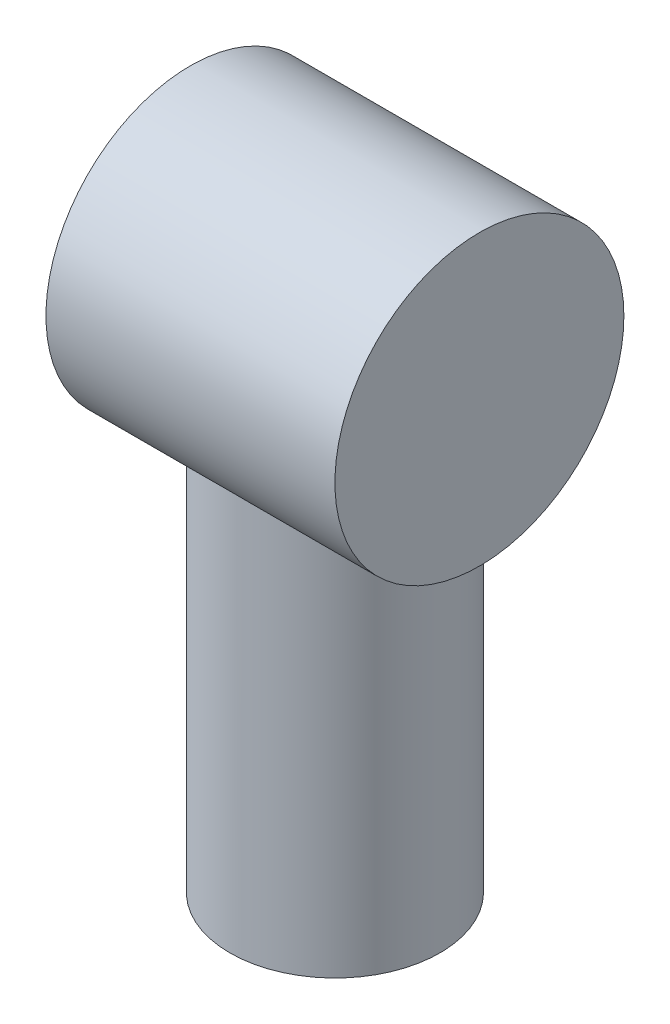
ISO-10303-21;
HEADER;
FILE_DESCRIPTION(('STEP AP214'),'2;1');
FILE_NAME('part.step','',(''),(''),'','','');
FILE_SCHEMA(('AUTOMOTIVE_DESIGN { 1 0 10303 214 1 1 1 1 }'));
ENDSEC;
DATA;
#1=APPLICATION_CONTEXT('core data for automotive mechanical design processes');
#2=APPLICATION_PROTOCOL_DEFINITION('international standard','automotive_design',2000,#1);
#3=PRODUCT_CONTEXT('',#1,'mechanical');
#4=PRODUCT('Part','Part','',(#3));
#5=PRODUCT_RELATED_PRODUCT_CATEGORY('part','',(#4));
#6=PRODUCT_DEFINITION_FORMATION('','',#4);
#7=PRODUCT_DEFINITION_CONTEXT('part definition',#1,'design');
#8=PRODUCT_DEFINITION('design','',#6,#7);
#9=PRODUCT_DEFINITION_SHAPE('','',#8);
#10=(LENGTH_UNIT() NAMED_UNIT(*) SI_UNIT(.MILLI.,.METRE.));
#11=(NAMED_UNIT(*) PLANE_ANGLE_UNIT() SI_UNIT($,.RADIAN.));
#12=(NAMED_UNIT(*) SI_UNIT($,.STERADIAN.) SOLID_ANGLE_UNIT());
#13=UNCERTAINTY_MEASURE_WITH_UNIT(LENGTH_MEASURE(1.E-05),#10,'distance_accuracy_value','');
#14=(GEOMETRIC_REPRESENTATION_CONTEXT(3) GLOBAL_UNCERTAINTY_ASSIGNED_CONTEXT((#13)) GLOBAL_UNIT_ASSIGNED_CONTEXT((#10,
#11,#12)) REPRESENTATION_CONTEXT('',''));
#15=CARTESIAN_POINT('',(0.,0.,0.));
#16=DIRECTION('',(0.,0.,1.));
#17=DIRECTION('',(1.,0.,0.));
#18=AXIS2_PLACEMENT_3D('',#15,#16,#17);
#19=CARTESIAN_POINT('',(55.,0.,0.));
#20=DIRECTION('',(-1.,0.,0.));
#21=DIRECTION('',(0.,0.,1.));
#22=AXIS2_PLACEMENT_3D('',#19,#20,#21);
#23=CYLINDRICAL_SURFACE('',#22,55.);
#24=CARTESIAN_POINT('',(0.,-37.7491721763537,40.));
#25=CARTESIAN_POINT('',(-0.472777525437341,-37.7491715208827,40.0000004275268));
#26=CARTESIAN_POINT('',(-0.945554287823784,-37.7580650299189,39.9916131643164));
#27=CARTESIAN_POINT('',(-1.8899123425948,-37.7935059068727,39.9581218508403));
#28=CARTESIAN_POINT('',(-2.36149346080809,-37.8200557134208,39.9330154913866));
#29=CARTESIAN_POINT('',(-3.3023760838275,-37.8904416975838,39.8662362706953));
#30=CARTESIAN_POINT('',(-3.77167662070743,-37.9342846594488,39.8245569076769));
#31=CARTESIAN_POINT('',(-4.70670406058051,-38.0386245840344,39.7249060764801));
#32=CARTESIAN_POINT('',(-5.17243045325298,-38.0991238811101,39.6669323246487));
#33=CARTESIAN_POINT('',(-6.56492360336293,-38.304768865868,39.4687413276709));
#34=CARTESIAN_POINT('',(-7.48490816670641,-38.4738991785993,39.304405011021));
#35=CARTESIAN_POINT('',(-9.29937238115574,-38.8676295989345,38.915080581805));
#36=CARTESIAN_POINT('',(-10.1938532555896,-39.092227040953,38.6900953837964));
#37=CARTESIAN_POINT('',(-11.941908076244,-39.5842739902622,38.1864823898703));
#38=CARTESIAN_POINT('',(-12.7958614603872,-39.8511317203621,37.908585991003));
#39=CARTESIAN_POINT('',(-14.4725215863588,-40.4206859617582,37.3006906044792));
#40=CARTESIAN_POINT('',(-15.2952284134522,-40.7233823752494,36.9706917590114));
#41=CARTESIAN_POINT('',(-16.907875195408,-41.3560905887806,36.2615423868658));
#42=CARTESIAN_POINT('',(-17.697824586332,-41.6860944394683,35.8824061462964));
#43=CARTESIAN_POINT('',(-19.2445291889931,-42.3658984130772,35.0771774034454));
#44=CARTESIAN_POINT('',(-20.0012821493163,-42.7156998750183,34.6510817231916));
#45=CARTESIAN_POINT('',(-21.6239684958769,-43.4970933654617,33.6670450317415));
#46=CARTESIAN_POINT('',(-22.4827812598994,-43.9314400099203,33.099530250637));
#47=CARTESIAN_POINT('',(-24.1514910524378,-44.8083783027913,31.902351613847));
#48=CARTESIAN_POINT('',(-24.9613841661636,-45.2509706073634,31.2726827948842));
#49=CARTESIAN_POINT('',(-26.5317909334083,-46.1358286658042,29.9519276134289));
#50=CARTESIAN_POINT('',(-27.2922394250646,-46.5780932586324,29.2607629369927));
#51=CARTESIAN_POINT('',(-28.760442579446,-47.4533012856293,27.8189781284543));
#52=CARTESIAN_POINT('',(-29.4681932183535,-47.8862440062231,27.0683534652156));
#53=CARTESIAN_POINT('',(-30.9549273255999,-48.814033062229,25.36335282927));
#54=CARTESIAN_POINT('',(-31.7225539740411,-49.3053529985706,24.3970953817057));
#55=CARTESIAN_POINT('',(-33.1729815917269,-50.2508147484749,22.3850535993973));
#56=CARTESIAN_POINT('',(-33.8557651183179,-50.7049489105978,21.3392529826098));
#57=CARTESIAN_POINT('',(-34.809228430649,-51.3481034619426,19.7157539862492));
#58=CARTESIAN_POINT('',(-35.1150709284651,-51.5560122401258,19.1658669340818));
#59=CARTESIAN_POINT('',(-35.7023844188761,-51.9578128359533,18.0482166653255));
#60=CARTESIAN_POINT('',(-35.9838569260276,-52.1517055245518,17.4804545626377));
#61=CARTESIAN_POINT('',(-36.5211031770272,-52.5238371754566,16.3282833701184));
#62=CARTESIAN_POINT('',(-36.7768905712406,-52.7020844461182,15.7438833367664));
#63=CARTESIAN_POINT('',(-37.2617966211442,-53.0416018958057,14.5591329962116));
#64=CARTESIAN_POINT('',(-37.4909088066728,-53.2028679550788,13.9587788624795));
#65=CARTESIAN_POINT('',(-38.0128598043247,-53.5717301271043,12.484672439551));
#66=CARTESIAN_POINT('',(-38.2912900138909,-53.7698123123291,11.6033621725185));
#67=CARTESIAN_POINT('',(-38.7879881976645,-54.1246506115559,9.8159018335571));
#68=CARTESIAN_POINT('',(-39.0062697711724,-54.2814160667107,8.90975742752422));
#69=CARTESIAN_POINT('',(-39.2863886594642,-54.4831737583324,7.53644820770415));
#70=CARTESIAN_POINT('',(-39.3718674287687,-54.5448537597165,7.07640735257552));
#71=CARTESIAN_POINT('',(-39.5268017508017,-54.6567945717336,6.15234926663021));
#72=CARTESIAN_POINT('',(-39.5962603137854,-54.707057527644,5.6883327998684));
#73=CARTESIAN_POINT('',(-39.7802284494862,-54.8403065686442,4.29129461342989));
#74=CARTESIAN_POINT('',(-39.8703487120803,-54.9057660046489,3.35319489905717));
#75=CARTESIAN_POINT('',(-39.9841971637796,-54.9884945243538,1.46878696954941));
#76=CARTESIAN_POINT('',(-40.0077717267431,-55.005652099047,0.522464811365877));
#77=CARTESIAN_POINT('',(-39.9877480180763,-54.9910895765311,-1.36911748946798));
#78=CARTESIAN_POINT('',(-39.9441500045903,-54.9593696671581,-2.31437763618564));
#79=CARTESIAN_POINT('',(-39.7904400597091,-54.8477560254818,-4.19677798516716));
#80=CARTESIAN_POINT('',(-39.6803136749483,-54.7678518250923,-5.13391637808244));
#81=CARTESIAN_POINT('',(-39.3951983977056,-54.5616346346594,-6.99305317115967));
#82=CARTESIAN_POINT('',(-39.2202097049095,-54.4353217874902,-7.91505161792252));
#83=CARTESIAN_POINT('',(-38.8138485866916,-54.143286759262,-9.71124903177319));
#84=CARTESIAN_POINT('',(-38.5842625456815,-53.978816551456,-10.5860584306442));
#85=CARTESIAN_POINT('',(-38.0690879189009,-53.6117784717427,-12.310750573055));
#86=CARTESIAN_POINT('',(-37.7835008110096,-53.4092116052196,-13.1606339737166));
#87=CARTESIAN_POINT('',(-37.1593976224529,-52.9695363924173,-14.8315430493695));
#88=CARTESIAN_POINT('',(-36.8208775840682,-52.7324254634186,-15.6525665609217));
#89=CARTESIAN_POINT('',(-36.0941201459295,-52.2275521183576,-17.2625227759151));
#90=CARTESIAN_POINT('',(-35.705879797607,-51.9597878845593,-18.0514535724997));
#91=CARTESIAN_POINT('',(-34.837319542577,-51.3665971941422,-19.6800500621035));
#92=CARTESIAN_POINT('',(-34.3515652793803,-51.0380685487559,-20.515687401547));
#93=CARTESIAN_POINT('',(-33.3266202612182,-50.353927181007,-22.1418230973124));
#94=CARTESIAN_POINT('',(-32.7874261720738,-49.9983127690495,-22.9323186323234));
#95=CARTESIAN_POINT('',(-31.6587029499332,-49.2654951297343,-24.4670109187113));
#96=CARTESIAN_POINT('',(-31.0691332049748,-48.8882745661945,-25.2111694624624));
#97=CARTESIAN_POINT('',(-29.8430475890611,-48.1183941173998,-26.6512083361569));
#98=CARTESIAN_POINT('',(-29.2065294629092,-47.7257334908948,-27.3470863437927));
#99=CARTESIAN_POINT('',(-27.7641609215849,-46.8557103346422,-28.8167116289474));
#100=CARTESIAN_POINT('',(-26.9490689528992,-46.3763878715164,-29.5802534248481));
#101=CARTESIAN_POINT('',(-25.2587939010624,-45.4150112013779,-31.036073223549));
#102=CARTESIAN_POINT('',(-24.3835988541403,-44.9329564681178,-31.7283369692121));
#103=CARTESIAN_POINT('',(-22.5749815250504,-43.977719331239,-33.0396468568349));
#104=CARTESIAN_POINT('',(-21.6415450155899,-43.5045391325068,-33.6586750009159));
#105=CARTESIAN_POINT('',(-19.7180285840917,-42.5803859618246,-34.8204143027477));
#106=CARTESIAN_POINT('',(-18.7279635769952,-42.1294072001062,-35.3631454267461));
#107=CARTESIAN_POINT('',(-16.9133580344208,-41.358696785528,-36.2591766213804));
#108=CARTESIAN_POINT('',(-16.0995482891531,-41.031727590498,-36.6280215975784));
#109=CARTESIAN_POINT('',(-14.4387104354404,-40.4089578557714,-37.3139472299466));
#110=CARTESIAN_POINT('',(-13.5916838521959,-40.1131558872793,-37.6310302594001));
#111=CARTESIAN_POINT('',(-11.8677700370794,-39.5623346299101,-38.2096989752337));
#112=CARTESIAN_POINT('',(-10.9909416199677,-39.307240095739,-38.4713873548394));
#113=CARTESIAN_POINT('',(-9.20912659374681,-38.8467281692586,-38.9363463957933));
#114=CARTESIAN_POINT('',(-8.30414578504876,-38.6413006192691,-39.1396290036459));
#115=CARTESIAN_POINT('',(-6.62111121052336,-38.3180504855299,-39.4559173618477));
#116=CARTESIAN_POINT('',(-5.84650411293052,-38.1913951767207,-39.578250171628));
#117=CARTESIAN_POINT('',(-4.28540063745122,-37.9837680583105,-39.7775593585752));
#118=CARTESIAN_POINT('',(-3.4989056562417,-37.9027909242814,-39.8545410220969));
#119=CARTESIAN_POINT('',(-1.91976397266554,-37.7897581150668,-39.9617356376636));
#120=CARTESIAN_POINT('',(-1.12712205764128,-37.7576675910857,-39.9919819052323));
#121=CARTESIAN_POINT('',(0.459026953557407,-37.7436327359253,-40.0052283519457));
#122=CARTESIAN_POINT('',(1.2525340688565,-37.7616895366411,-39.9882274646563));
#123=CARTESIAN_POINT('',(2.83336894125615,-37.8471366850775,-39.9073631368482));
#124=CARTESIAN_POINT('',(3.62070359863762,-37.9144603468173,-39.8435630419003));
#125=CARTESIAN_POINT('',(5.18484676476512,-38.09565554189,-39.6703494690531));
#126=CARTESIAN_POINT('',(5.96165529829737,-38.2095269655959,-39.5609360985802));
#127=CARTESIAN_POINT('',(7.50127900420736,-38.4797851873003,-39.2981115828839));
#128=CARTESIAN_POINT('',(8.26407453138094,-38.6362274345037,-39.1446430406485));
#129=CARTESIAN_POINT('',(9.77128440843401,-38.9864121237655,-38.7958844658502));
#130=CARTESIAN_POINT('',(10.5156961620232,-39.1801598007627,-38.6005885633695));
#131=CARTESIAN_POINT('',(12.2805548754334,-39.6842062471464,-38.0833498706039));
#132=CARTESIAN_POINT('',(13.2909753372365,-40.0099634277059,-37.7421214454983));
#133=CARTESIAN_POINT('',(15.267204604008,-40.7091151140211,-36.9869248432945));
#134=CARTESIAN_POINT('',(16.2329950544541,-41.0825289856973,-36.5729270694724));
#135=CARTESIAN_POINT('',(18.1194666874195,-41.8637887499044,-35.6760063128531));
#136=CARTESIAN_POINT('',(19.040073386956,-42.2716886644418,-35.192974339965));
#137=CARTESIAN_POINT('',(20.8334644887245,-43.1092168291042,-34.1619171767386));
#138=CARTESIAN_POINT('',(21.7062537950731,-43.5388428422926,-33.6138986696828));
#139=CARTESIAN_POINT('',(23.428651190164,-44.4222802566785,-32.4379089786043));
#140=CARTESIAN_POINT('',(24.2767869074823,-44.8764307315186,-31.8080377881027));
#141=CARTESIAN_POINT('',(25.920189842108,-45.7863316069423,-30.4837235066798));
#142=CARTESIAN_POINT('',(26.7154546696387,-46.2420820788673,-29.7892775003601));
#143=CARTESIAN_POINT('',(28.2503226753508,-47.1454796126411,-28.3378531847097));
#144=CARTESIAN_POINT('',(28.9899690771941,-47.5931327574462,-27.5809244137727));
#145=CARTESIAN_POINT('',(30.4112071778751,-48.4719479976589,-26.0054568741482));
#146=CARTESIAN_POINT('',(31.0928018920726,-48.9031109489695,-25.1869213096474));
#147=CARTESIAN_POINT('',(32.3654588752856,-49.7221919498896,-23.5270535108251));
#148=CARTESIAN_POINT('',(32.9591783472252,-50.1111768735611,-22.6882884898475));
#149=CARTESIAN_POINT('',(34.0856178398835,-50.8591390404203,-20.9579634023477));
#150=CARTESIAN_POINT('',(34.6183394753056,-51.2181170778669,-20.0664047343));
#151=CARTESIAN_POINT('',(35.6178336416793,-51.8989038940104,-18.2334645335709));
#152=CARTESIAN_POINT('',(36.0846119391558,-52.220715922301,-17.2920873672592));
#153=CARTESIAN_POINT('',(36.9469001279355,-52.8202368285406,-15.3636662635375));
#154=CARTESIAN_POINT('',(37.3424105971396,-53.0979460641108,-14.3766226965115));
#155=CARTESIAN_POINT('',(38.0597908857208,-53.6048748069556,-12.3536612326338));
#156=CARTESIAN_POINT('',(38.3810032362989,-53.8336601353337,-11.3173980422342));
#157=CARTESIAN_POINT('',(38.8002512000713,-54.1336320686886,-9.73846266163449));
#158=CARTESIAN_POINT('',(38.9295907021352,-54.2264352151313,-9.2079577393254));
#159=CARTESIAN_POINT('',(39.1668547154087,-54.3970189136481,-8.13981483227865));
#160=CARTESIAN_POINT('',(39.2747820943924,-54.4748014774257,-7.60217781306308));
#161=CARTESIAN_POINT('',(39.4686338653715,-54.6147285288753,-6.5213643450058));
#162=CARTESIAN_POINT('',(39.5545747563976,-54.6768847422138,-5.97819236986744));
#163=CARTESIAN_POINT('',(39.7041271513716,-54.7851718258269,-4.887265370253));
#164=CARTESIAN_POINT('',(39.7677416177816,-54.8313048221914,-4.33951096369593));
#165=CARTESIAN_POINT('',(39.8723225922731,-54.9072017622569,-3.24073788632891));
#166=CARTESIAN_POINT('',(39.9132905495326,-54.936966753366,-2.68971942667094));
#167=CARTESIAN_POINT('',(39.972373424598,-54.9799077863742,-1.58587309377786));
#168=CARTESIAN_POINT('',(39.9904892403527,-54.9930844800914,-1.03304529249462));
#169=CARTESIAN_POINT('',(40.008477855071,-55.0061634179417,0.467336820707096));
#170=CARTESIAN_POINT('',(39.9861509352134,-54.98991477589,1.41544300835717));
#171=CARTESIAN_POINT('',(39.8744404401192,-54.9087387863928,3.3053561929011));
#172=CARTESIAN_POINT('',(39.785064479232,-54.8438169664629,4.24716389282344));
#173=CARTESIAN_POINT('',(39.5406495683541,-54.6667711484699,6.11773316185043));
#174=CARTESIAN_POINT('',(39.3856094966133,-54.5546463440312,7.04649450780215));
#175=CARTESIAN_POINT('',(39.012108754824,-54.2856137945498,8.88453725346419));
#176=CARTESIAN_POINT('',(38.793646150833,-54.1287046839023,9.7938180582466));
#177=CARTESIAN_POINT('',(38.3015604273908,-53.7771378929718,11.5680525356288));
#178=CARTESIAN_POINT('',(38.0292199963387,-53.5833614108389,12.4335385785516));
#179=CARTESIAN_POINT('',(37.42974036491,-53.1595760548316,14.1360926043604));
#180=CARTESIAN_POINT('',(37.1026027427616,-52.9295682244772,14.9731614048641));
#181=CARTESIAN_POINT('',(36.3967978609415,-52.437228675344,16.6154142377248));
#182=CARTESIAN_POINT('',(36.0181291414834,-52.1748960408796,17.4205973659818));
#183=CARTESIAN_POINT('',(35.2125177371522,-51.6220454109289,18.9963622170251));
#184=CARTESIAN_POINT('',(34.7855719220647,-51.3315255880012,19.7669416916315));
#185=CARTESIAN_POINT('',(33.8269493097988,-50.6864929406944,21.3710625319133));
#186=CARTESIAN_POINT('',(33.2888903432122,-50.3286001156704,22.1994327424693));
#187=CARTESIAN_POINT('',(32.1588666861314,-49.5884099485121,23.8069918074183));
#188=CARTESIAN_POINT('',(31.5668979360292,-49.2061107691374,24.5861769504991));
#189=CARTESIAN_POINT('',(30.3317735911873,-48.4230116088112,26.0947313347517));
#190=CARTESIAN_POINT('',(29.6885571022254,-48.0221898634905,26.8240393398735));
#191=CARTESIAN_POINT('',(28.3543735243903,-47.2090119336632,28.230644423492));
#192=CARTESIAN_POINT('',(27.6634043452695,-46.7966552447158,28.9079392225051));
#193=CARTESIAN_POINT('',(26.1002989751669,-45.8884214619233,30.3330760409891));
#194=CARTESIAN_POINT('',(25.2186698989358,-45.3915479500449,31.0699064704151));
#195=CARTESIAN_POINT('',(23.3931554901753,-44.4032713198633,32.4666218617275));
#196=CARTESIAN_POINT('',(22.449254516768,-43.9118696124198,33.126487376197));
#197=CARTESIAN_POINT('',(20.5012875766152,-42.9486453882985,34.3661117290513));
#198=CARTESIAN_POINT('',(19.497244985812,-42.476815383607,34.9459014054813));
#199=CARTESIAN_POINT('',(17.4300906834097,-41.5685778235717,36.0214987237603));
#200=CARTESIAN_POINT('',(16.3670053891275,-41.1321546379399,36.5173435291655));
#201=CARTESIAN_POINT('',(14.5013704660994,-40.4323567159635,37.2882223800122));
#202=CARTESIAN_POINT('',(13.7130033893808,-40.1555760524169,37.5855283937744));
#203=CARTESIAN_POINT('',(12.1087493616476,-39.6364217616533,38.1326139822269));
#204=CARTESIAN_POINT('',(11.2928629078207,-39.394047513233,38.382394415013));
#205=CARTESIAN_POINT('',(9.63833047687809,-38.9520745920685,38.8308502432068));
#206=CARTESIAN_POINT('',(8.79975526744725,-38.7523570720073,39.0296679456685));
#207=CARTESIAN_POINT('',(7.10189336319898,-38.4024381705056,39.3740154562367));
#208=CARTESIAN_POINT('',(6.2426162537186,-38.2522143281255,39.5195694395109));
#209=CARTESIAN_POINT('',(4.49070461477094,-38.0052700747118,39.7571364997708));
#210=CARTESIAN_POINT('',(3.59774695233555,-37.9096946046393,39.8480057915954));
#211=CARTESIAN_POINT('',(2.25210556637388,-37.8136336593572,39.9390873108764));
#212=CARTESIAN_POINT('',(1.80243615244699,-37.7894969633027,39.9619107854496));
#213=CARTESIAN_POINT('',(0.901844472254169,-37.7572642766446,39.9923690639454));
#214=CARTESIAN_POINT('',(0.45092188906074,-37.7491728015236,39.999999592237));
#215=CARTESIAN_POINT('',(0.,-37.7491721763537,40.));
#216=B_SPLINE_CURVE_WITH_KNOTS('',3,(#24,#25,#26,#27,#28,#29,#30,#31,#32,#33,#34,#35,#36,#37,
#38,#39,#40,#41,#42,#43,#44,#45,#46,#47,#48,#49,#50,#51,#52,#53,#54,#55,#56,#57,#58,#59,#60,#61,
#62,#63,#64,#65,#66,#67,#68,#69,#70,#71,#72,#73,#74,#75,#76,#77,#78,#79,#80,#81,#82,#83,#84,#85,
#86,#87,#88,#89,#90,#91,#92,#93,#94,#95,#96,#97,#98,#99,#100,#101,#102,#103,#104,#105,#106,#107,
#108,#109,#110,#111,#112,#113,#114,#115,#116,#117,#118,#119,#120,#121,#122,#123,#124,#125,#126,
#127,#128,#129,#130,#131,#132,#133,#134,#135,#136,#137,#138,#139,#140,#141,#142,#143,#144,#145,
#146,#147,#148,#149,#150,#151,#152,#153,#154,#155,#156,#157,#158,#159,#160,#161,#162,#163,#164,
#165,#166,#167,#168,#169,#170,#171,#172,#173,#174,#175,#176,#177,#178,#179,#180,#181,#182,#183,
#184,#185,#186,#187,#188,#189,#190,#191,#192,#193,#194,#195,#196,#197,#198,#199,#200,#201,#202,
#203,#204,#205,#206,#207,#208,#209,#210,#211,#212,#213,#214,#215),.UNSPECIFIED.,.T.,.F.,(4,2,2,
2,2,2,2,2,2,2,2,2,2,2,2,2,2,2,2,2,2,2,2,2,2,2,2,2,2,2,2,2,2,2,2,2,2,2,2,2,2,2,2,2,2,2,2,2,2,2,2,
2,2,2,2,2,2,2,2,2,2,2,2,2,2,2,2,2,2,2,2,2,2,2,2,2,2,2,2,2,2,2,2,2,2,2,2,2,2,2,2,2,2,2,2,4),(0.,
1.41817314487782,2.83654220390633,4.2554682553604,5.67459326805596,8.51913928584883,
11.3635486298033,14.1711709527896,16.9787856138468,19.7855858181162,22.5925760888972,
25.9413792095489,29.2904499637538,32.6438484769821,35.9975027815756,39.9770411137444,
43.9573962388973,45.9447367620128,47.9319536862378,49.9181088506261,51.9047447644153,
54.7373517689913,57.5693178090741,58.984830244498,60.4000764828871,63.2302938632547,
66.0670397072402,68.9037746496365,71.7411260977141,74.5784688107586,77.3333541640479,
80.0881668251437,82.8431855582058,85.5983677481409,88.6580313861988,91.7178860408983,
94.7802312010201,97.8427235588431,101.485105766837,105.128215119738,108.772217926556,
112.415265348186,115.267379570775,118.119362987287,120.966012039465,123.812078413694,
126.192693958901,128.573031952805,130.951672328648,133.330366394158,135.705846680131,
138.08132137151,140.459905092041,142.838822834374,146.179150805081,149.520840509756,
152.867865528382,156.214546633518,159.661247792294,163.108104637004,166.552254474655,
169.996225304711,173.28940824563,176.582503990939,179.875311587532,183.168092482005,
186.488982766594,188.15005862881,189.810911868964,191.470515096721,193.129898030716,
194.789174766462,196.448386300811,199.289972922009,202.131236890438,204.972549398576,
207.813948555921,210.594444608118,213.374860592282,216.155355357198,218.936030508709,
222.084851997118,225.233910799919,228.386768878178,231.539765051978,235.291243123347,
239.043667070229,242.794641865583,246.54395168515,249.202470900372,251.86094211028,
254.511906951875,257.16166708522,259.865080205933,261.217313317359,262.569926923329),.UNSPECIFIED.);
#217=CARTESIAN_POINT('',(0.,-37.7491721763537,40.));
#218=VERTEX_POINT('',#217);
#219=EDGE_CURVE('E35',#218,#218,#216,.T.);
#220=ORIENTED_EDGE('',*,*,#219,.F.);
#221=EDGE_LOOP('',(#220));
#222=FACE_BOUND('',#221,.T.);
#223=CARTESIAN_POINT('',(55.,0.,0.));
#224=DIRECTION('',(1.,0.,0.));
#225=DIRECTION('',(0.,0.,-1.));
#226=AXIS2_PLACEMENT_3D('',#223,#224,#225);
#227=CIRCLE('',#226,55.);
#228=CARTESIAN_POINT('',(55.,0.,-55.));
#229=VERTEX_POINT('',#228);
#230=EDGE_CURVE('E46',#229,#229,#227,.T.);
#231=ORIENTED_EDGE('',*,*,#230,.F.);
#232=EDGE_LOOP('',(#231));
#233=FACE_BOUND('',#232,.T.);
#234=CARTESIAN_POINT('',(-55.,0.,0.));
#235=DIRECTION('',(1.,0.,0.));
#236=DIRECTION('',(0.,0.,-1.));
#237=AXIS2_PLACEMENT_3D('',#234,#235,#236);
#238=CIRCLE('',#237,55.);
#239=CARTESIAN_POINT('',(-55.,0.,-55.));
#240=VERTEX_POINT('',#239);
#241=EDGE_CURVE('E48',#240,#240,#238,.T.);
#242=ORIENTED_EDGE('',*,*,#241,.T.);
#243=EDGE_LOOP('',(#242));
#244=FACE_BOUND('',#243,.T.);
#245=ADVANCED_FACE('F30',(#222,#233,#244),#23,.T.);
#246=CARTESIAN_POINT('',(55.,0.,0.));
#247=DIRECTION('',(1.,0.,0.));
#248=DIRECTION('',(0.,0.,-1.));
#249=AXIS2_PLACEMENT_3D('',#246,#247,#248);
#250=PLANE('',#249);
#251=ORIENTED_EDGE('',*,*,#230,.T.);
#252=EDGE_LOOP('',(#251));
#253=FACE_BOUND('',#252,.T.);
#254=ADVANCED_FACE('F54',(#253),#250,.T.);
#255=CARTESIAN_POINT('',(-55.,0.,0.));
#256=DIRECTION('',(1.,0.,0.));
#257=DIRECTION('',(0.,0.,-1.));
#258=AXIS2_PLACEMENT_3D('',#255,#256,#257);
#259=PLANE('',#258);
#260=ORIENTED_EDGE('',*,*,#241,.F.);
#261=EDGE_LOOP('',(#260));
#262=FACE_BOUND('',#261,.T.);
#263=ADVANCED_FACE('F61',(#262),#259,.F.);
#264=CARTESIAN_POINT('',(0.,-190.,0.));
#265=DIRECTION('',(0.,1.,0.));
#266=DIRECTION('',(0.,0.,1.));
#267=AXIS2_PLACEMENT_3D('',#264,#265,#266);
#268=CYLINDRICAL_SURFACE('',#267,40.);
#269=CARTESIAN_POINT('',(0.,-190.,0.));
#270=DIRECTION('',(0.,1.,0.));
#271=DIRECTION('',(0.,0.,1.));
#272=AXIS2_PLACEMENT_3D('',#269,#270,#271);
#273=CIRCLE('',#272,40.);
#274=CARTESIAN_POINT('',(0.,-190.,40.));
#275=VERTEX_POINT('',#274);
#276=EDGE_CURVE('E10',#275,#275,#273,.T.);
#277=ORIENTED_EDGE('',*,*,#276,.T.);
#278=EDGE_LOOP('',(#277));
#279=FACE_BOUND('',#278,.T.);
#280=ORIENTED_EDGE('',*,*,#219,.T.);
#281=EDGE_LOOP('',(#280));
#282=FACE_BOUND('',#281,.T.);
#283=ADVANCED_FACE('F32',(#279,#282),#268,.T.);
#284=CARTESIAN_POINT('',(0.,-190.,0.));
#285=DIRECTION('',(0.,1.,0.));
#286=DIRECTION('',(0.,0.,1.));
#287=AXIS2_PLACEMENT_3D('',#284,#285,#286);
#288=PLANE('',#287);
#289=ORIENTED_EDGE('',*,*,#276,.F.);
#290=EDGE_LOOP('',(#289));
#291=FACE_BOUND('',#290,.T.);
#292=ADVANCED_FACE('F68',(#291),#288,.F.);
#293=CLOSED_SHELL('',(#245,#254,#263,#283,#292));
#294=MANIFOLD_SOLID_BREP('B2',#293);
#295=ADVANCED_BREP_SHAPE_REPRESENTATION('',(#18,#294),#14);
#296=SHAPE_DEFINITION_REPRESENTATION(#9,#295);
ENDSEC;
END-ISO-10303-21;
